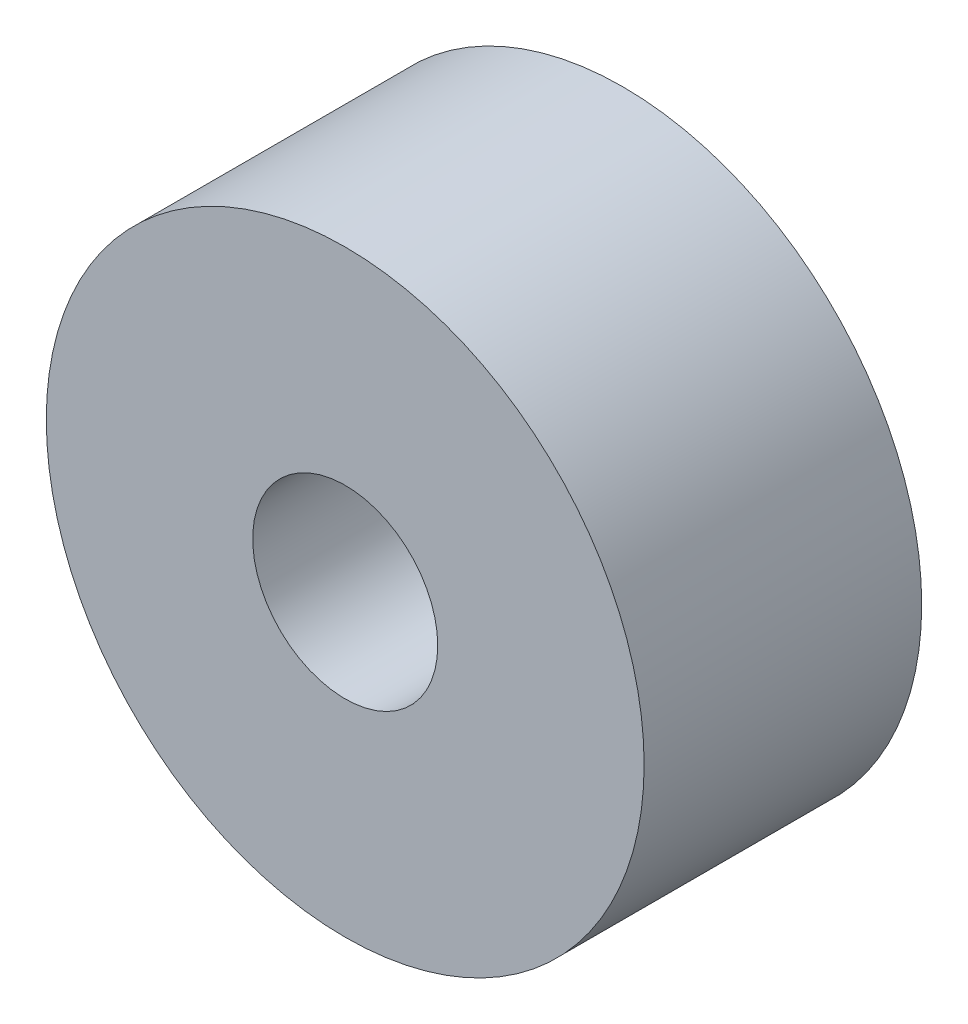
ISO-10303-21;
HEADER;
FILE_DESCRIPTION(('STEP AP214'),'2;1');
FILE_NAME('part.step','',(''),(''),'','','');
FILE_SCHEMA(('AUTOMOTIVE_DESIGN { 1 0 10303 214 1 1 1 1 }'));
ENDSEC;
DATA;
#1=APPLICATION_CONTEXT('core data for automotive mechanical design processes');
#2=APPLICATION_PROTOCOL_DEFINITION('international standard','automotive_design',2000,#1);
#3=PRODUCT_CONTEXT('',#1,'mechanical');
#4=PRODUCT('Part','Part','',(#3));
#5=PRODUCT_RELATED_PRODUCT_CATEGORY('part','',(#4));
#6=PRODUCT_DEFINITION_FORMATION('','',#4);
#7=PRODUCT_DEFINITION_CONTEXT('part definition',#1,'design');
#8=PRODUCT_DEFINITION('design','',#6,#7);
#9=PRODUCT_DEFINITION_SHAPE('','',#8);
#10=(LENGTH_UNIT() NAMED_UNIT(*) SI_UNIT(.MILLI.,.METRE.));
#11=(NAMED_UNIT(*) PLANE_ANGLE_UNIT() SI_UNIT($,.RADIAN.));
#12=(NAMED_UNIT(*) SI_UNIT($,.STERADIAN.) SOLID_ANGLE_UNIT());
#13=UNCERTAINTY_MEASURE_WITH_UNIT(LENGTH_MEASURE(1.E-05),#10,'distance_accuracy_value','');
#14=(GEOMETRIC_REPRESENTATION_CONTEXT(3) GLOBAL_UNCERTAINTY_ASSIGNED_CONTEXT((#13)) GLOBAL_UNIT_ASSIGNED_CONTEXT((#10,
#11,#12)) REPRESENTATION_CONTEXT('',''));
#15=CARTESIAN_POINT('',(0.,0.,0.));
#16=DIRECTION('',(0.,0.,1.));
#17=DIRECTION('',(1.,0.,0.));
#18=AXIS2_PLACEMENT_3D('',#15,#16,#17);
#19=CARTESIAN_POINT('',(0.,0.,15.));
#20=DIRECTION('',(0.,0.,1.));
#21=DIRECTION('',(1.,0.,0.));
#22=AXIS2_PLACEMENT_3D('',#19,#20,#21);
#23=PLANE('',#22);
#24=CARTESIAN_POINT('',(0.,0.,15.));
#25=DIRECTION('',(0.,0.,1.));
#26=DIRECTION('',(1.,0.,0.));
#27=AXIS2_PLACEMENT_3D('',#24,#25,#26);
#28=CIRCLE('',#27,32.3076923076923);
#29=CARTESIAN_POINT('',(32.3076923076923,0.,15.));
#30=VERTEX_POINT('',#29);
#31=EDGE_CURVE('E10',#30,#30,#28,.T.);
#32=ORIENTED_EDGE('',*,*,#31,.T.);
#33=EDGE_LOOP('',(#32));
#34=FACE_BOUND('',#33,.T.);
#35=CARTESIAN_POINT('',(0.,0.,15.));
#36=DIRECTION('',(0.,0.,1.));
#37=DIRECTION('',(1.,0.,0.));
#38=AXIS2_PLACEMENT_3D('',#35,#36,#37);
#39=CIRCLE('',#38,10.);
#40=CARTESIAN_POINT('',(10.,0.,15.));
#41=VERTEX_POINT('',#40);
#42=EDGE_CURVE('E46',#41,#41,#39,.T.);
#43=ORIENTED_EDGE('',*,*,#42,.F.);
#44=EDGE_LOOP('',(#43));
#45=FACE_BOUND('',#44,.T.);
#46=ADVANCED_FACE('F35',(#34,#45),#23,.T.);
#47=CARTESIAN_POINT('',(0.,0.,-15.));
#48=DIRECTION('',(0.,0.,1.));
#49=DIRECTION('',(1.,0.,0.));
#50=AXIS2_PLACEMENT_3D('',#47,#48,#49);
#51=PLANE('',#50);
#52=CARTESIAN_POINT('',(0.,0.,-15.));
#53=DIRECTION('',(0.,0.,1.));
#54=DIRECTION('',(1.,0.,0.));
#55=AXIS2_PLACEMENT_3D('',#52,#53,#54);
#56=CIRCLE('',#55,32.3076923076923);
#57=CARTESIAN_POINT('',(32.3076923076923,0.,-15.));
#58=VERTEX_POINT('',#57);
#59=EDGE_CURVE('E39',#58,#58,#56,.T.);
#60=ORIENTED_EDGE('',*,*,#59,.F.);
#61=EDGE_LOOP('',(#60));
#62=FACE_BOUND('',#61,.T.);
#63=CARTESIAN_POINT('',(0.,0.,-15.));
#64=DIRECTION('',(0.,0.,1.));
#65=DIRECTION('',(1.,0.,0.));
#66=AXIS2_PLACEMENT_3D('',#63,#64,#65);
#67=CIRCLE('',#66,10.);
#68=CARTESIAN_POINT('',(10.,0.,-15.));
#69=VERTEX_POINT('',#68);
#70=EDGE_CURVE('E48',#69,#69,#67,.T.);
#71=ORIENTED_EDGE('',*,*,#70,.T.);
#72=EDGE_LOOP('',(#71));
#73=FACE_BOUND('',#72,.T.);
#74=ADVANCED_FACE('F58',(#62,#73),#51,.F.);
#75=CARTESIAN_POINT('',(0.,0.,15.));
#76=DIRECTION('',(0.,0.,-1.));
#77=DIRECTION('',(-1.,0.,0.));
#78=AXIS2_PLACEMENT_3D('',#75,#76,#77);
#79=CYLINDRICAL_SURFACE('',#78,32.3076923076923);
#80=ORIENTED_EDGE('',*,*,#31,.F.);
#81=EDGE_LOOP('',(#80));
#82=FACE_BOUND('',#81,.T.);
#83=ORIENTED_EDGE('',*,*,#59,.T.);
#84=EDGE_LOOP('',(#83));
#85=FACE_BOUND('',#84,.T.);
#86=ADVANCED_FACE('F37',(#82,#85),#79,.T.);
#87=CARTESIAN_POINT('',(0.,0.,15.));
#88=DIRECTION('',(0.,0.,-1.));
#89=DIRECTION('',(-1.,0.,0.));
#90=AXIS2_PLACEMENT_3D('',#87,#88,#89);
#91=CYLINDRICAL_SURFACE('',#90,10.);
#92=ORIENTED_EDGE('',*,*,#42,.T.);
#93=EDGE_LOOP('',(#92));
#94=FACE_BOUND('',#93,.T.);
#95=ORIENTED_EDGE('',*,*,#70,.F.);
#96=EDGE_LOOP('',(#95));
#97=FACE_BOUND('',#96,.T.);
#98=ADVANCED_FACE('F54',(#94,#97),#91,.F.);
#99=CLOSED_SHELL('',(#46,#74,#86,#98));
#100=MANIFOLD_SOLID_BREP('B2',#99);
#101=ADVANCED_BREP_SHAPE_REPRESENTATION('',(#18,#100),#14);
#102=SHAPE_DEFINITION_REPRESENTATION(#9,#101);
ENDSEC;
END-ISO-10303-21;
